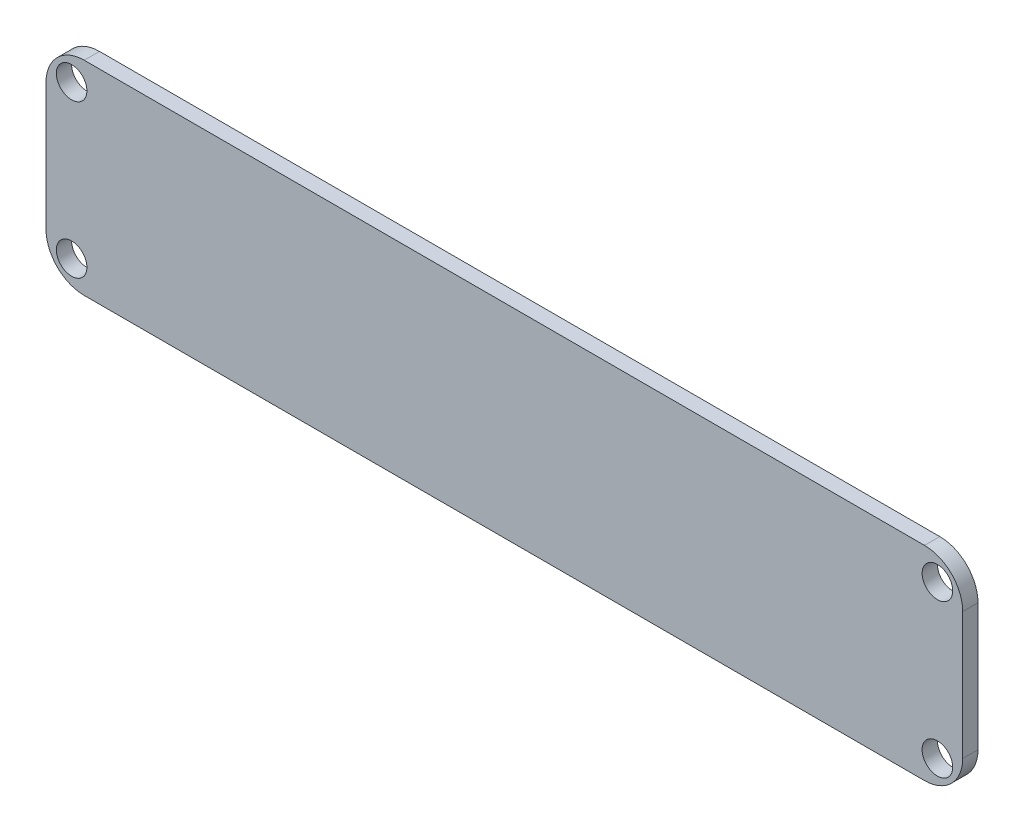
ISO-10303-21;
HEADER;
FILE_DESCRIPTION(('STEP AP214'),'2;1');
FILE_NAME('part.step','',(''),(''),'','','');
FILE_SCHEMA(('AUTOMOTIVE_DESIGN { 1 0 10303 214 1 1 1 1 }'));
ENDSEC;
DATA;
#1=APPLICATION_CONTEXT('core data for automotive mechanical design processes');
#2=APPLICATION_PROTOCOL_DEFINITION('international standard','automotive_design',2000,#1);
#3=PRODUCT_CONTEXT('',#1,'mechanical');
#4=PRODUCT('Part','Part','',(#3));
#5=PRODUCT_RELATED_PRODUCT_CATEGORY('part','',(#4));
#6=PRODUCT_DEFINITION_FORMATION('','',#4);
#7=PRODUCT_DEFINITION_CONTEXT('part definition',#1,'design');
#8=PRODUCT_DEFINITION('design','',#6,#7);
#9=PRODUCT_DEFINITION_SHAPE('','',#8);
#10=(LENGTH_UNIT() NAMED_UNIT(*) SI_UNIT(.MILLI.,.METRE.));
#11=(NAMED_UNIT(*) PLANE_ANGLE_UNIT() SI_UNIT($,.RADIAN.));
#12=(NAMED_UNIT(*) SI_UNIT($,.STERADIAN.) SOLID_ANGLE_UNIT());
#13=UNCERTAINTY_MEASURE_WITH_UNIT(LENGTH_MEASURE(1.E-05),#10,'distance_accuracy_value','');
#14=(GEOMETRIC_REPRESENTATION_CONTEXT(3) GLOBAL_UNCERTAINTY_ASSIGNED_CONTEXT((#13)) GLOBAL_UNIT_ASSIGNED_CONTEXT((#10,
#11,#12)) REPRESENTATION_CONTEXT('',''));
#15=CARTESIAN_POINT('',(0.,0.,0.));
#16=DIRECTION('',(0.,0.,1.));
#17=DIRECTION('',(1.,0.,0.));
#18=AXIS2_PLACEMENT_3D('',#15,#16,#17);
#19=CARTESIAN_POINT('',(0.,0.,1.2));
#20=DIRECTION('',(1.,0.,0.));
#21=DIRECTION('',(0.,0.,-1.));
#22=AXIS2_PLACEMENT_3D('',#19,#20,#21);
#23=PLANE('',#22);
#24=DIRECTION('',(0.,-1.,0.));
#25=VECTOR('',#24,1.);
#26=CARTESIAN_POINT('',(0.,0.,0.));
#27=LINE('',#26,#25);
#28=CARTESIAN_POINT('',(0.,13.,0.));
#29=VERTEX_POINT('',#28);
#30=CARTESIAN_POINT('',(0.,3.,0.));
#31=VERTEX_POINT('',#30);
#32=EDGE_CURVE('E136',#29,#31,#27,.T.);
#33=ORIENTED_EDGE('',*,*,#32,.T.);
#34=DIRECTION('',(0.,0.,-1.));
#35=VECTOR('',#34,1.);
#36=CARTESIAN_POINT('',(0.,3.,1.2));
#37=LINE('',#36,#35);
#38=CARTESIAN_POINT('',(0.,3.,1.2));
#39=VERTEX_POINT('',#38);
#40=EDGE_CURVE('E113',#31,#39,#37,.F.);
#41=ORIENTED_EDGE('',*,*,#40,.T.);
#42=DIRECTION('',(0.,-1.,0.));
#43=VECTOR('',#42,1.);
#44=CARTESIAN_POINT('',(0.,0.,1.2));
#45=LINE('',#44,#43);
#46=CARTESIAN_POINT('',(0.,13.,1.2));
#47=VERTEX_POINT('',#46);
#48=EDGE_CURVE('E146',#47,#39,#45,.T.);
#49=ORIENTED_EDGE('',*,*,#48,.F.);
#50=DIRECTION('',(0.,0.,-1.));
#51=VECTOR('',#50,1.);
#52=CARTESIAN_POINT('',(0.,13.,1.2));
#53=LINE('',#52,#51);
#54=EDGE_CURVE('E118',#47,#29,#53,.T.);
#55=ORIENTED_EDGE('',*,*,#54,.T.);
#56=EDGE_LOOP('',(#33,#41,#49,#55));
#57=FACE_BOUND('',#56,.T.);
#58=ADVANCED_FACE('F41',(#57),#23,.F.);
#59=CARTESIAN_POINT('',(0.,0.,1.2));
#60=DIRECTION('',(0.,1.,0.));
#61=DIRECTION('',(0.,0.,1.));
#62=AXIS2_PLACEMENT_3D('',#59,#60,#61);
#63=PLANE('',#62);
#64=DIRECTION('',(1.,0.,0.));
#65=VECTOR('',#64,1.);
#66=CARTESIAN_POINT('',(0.,0.,1.2));
#67=LINE('',#66,#65);
#68=CARTESIAN_POINT('',(3.,0.,1.2));
#69=VERTEX_POINT('',#68);
#70=CARTESIAN_POINT('',(69.,0.,1.2));
#71=VERTEX_POINT('',#70);
#72=EDGE_CURVE('E128',#69,#71,#67,.T.);
#73=ORIENTED_EDGE('',*,*,#72,.F.);
#74=DIRECTION('',(0.,0.,-1.));
#75=VECTOR('',#74,1.);
#76=CARTESIAN_POINT('',(3.,0.,1.2));
#77=LINE('',#76,#75);
#78=CARTESIAN_POINT('',(3.,0.,0.));
#79=VERTEX_POINT('',#78);
#80=EDGE_CURVE('E112',#69,#79,#77,.T.);
#81=ORIENTED_EDGE('',*,*,#80,.T.);
#82=DIRECTION('',(1.,0.,0.));
#83=VECTOR('',#82,1.);
#84=CARTESIAN_POINT('',(0.,0.,0.));
#85=LINE('',#84,#83);
#86=CARTESIAN_POINT('',(69.,0.,0.));
#87=VERTEX_POINT('',#86);
#88=EDGE_CURVE('E125',#79,#87,#85,.T.);
#89=ORIENTED_EDGE('',*,*,#88,.T.);
#90=DIRECTION('',(0.,0.,-1.));
#91=VECTOR('',#90,1.);
#92=CARTESIAN_POINT('',(69.,0.,1.2));
#93=LINE('',#92,#91);
#94=EDGE_CURVE('E130',#87,#71,#93,.F.);
#95=ORIENTED_EDGE('',*,*,#94,.T.);
#96=EDGE_LOOP('',(#73,#81,#89,#95));
#97=FACE_BOUND('',#96,.T.);
#98=ADVANCED_FACE('F124',(#97),#63,.F.);
#99=CARTESIAN_POINT('',(72.,0.,1.2));
#100=DIRECTION('',(-1.,0.,0.));
#101=DIRECTION('',(0.,0.,1.));
#102=AXIS2_PLACEMENT_3D('',#99,#100,#101);
#103=PLANE('',#102);
#104=DIRECTION('',(0.,1.,0.));
#105=VECTOR('',#104,1.);
#106=CARTESIAN_POINT('',(72.,0.,1.2));
#107=LINE('',#106,#105);
#108=CARTESIAN_POINT('',(72.,3.,1.2));
#109=VERTEX_POINT('',#108);
#110=CARTESIAN_POINT('',(72.,13.,1.2));
#111=VERTEX_POINT('',#110);
#112=EDGE_CURVE('E169',#109,#111,#107,.T.);
#113=ORIENTED_EDGE('',*,*,#112,.F.);
#114=DIRECTION('',(0.,0.,-1.));
#115=VECTOR('',#114,1.);
#116=CARTESIAN_POINT('',(72.,3.,1.2));
#117=LINE('',#116,#115);
#118=CARTESIAN_POINT('',(72.,3.,0.));
#119=VERTEX_POINT('',#118);
#120=EDGE_CURVE('E11',#109,#119,#117,.T.);
#121=ORIENTED_EDGE('',*,*,#120,.T.);
#122=DIRECTION('',(0.,1.,0.));
#123=VECTOR('',#122,1.);
#124=CARTESIAN_POINT('',(72.,0.,0.));
#125=LINE('',#124,#123);
#126=CARTESIAN_POINT('',(72.,13.,0.));
#127=VERTEX_POINT('',#126);
#128=EDGE_CURVE('E135',#119,#127,#125,.T.);
#129=ORIENTED_EDGE('',*,*,#128,.T.);
#130=DIRECTION('',(0.,0.,-1.));
#131=VECTOR('',#130,1.);
#132=CARTESIAN_POINT('',(72.,13.,1.2));
#133=LINE('',#132,#131);
#134=EDGE_CURVE('E49',#127,#111,#133,.F.);
#135=ORIENTED_EDGE('',*,*,#134,.T.);
#136=EDGE_LOOP('',(#113,#121,#129,#135));
#137=FACE_BOUND('',#136,.T.);
#138=ADVANCED_FACE('F168',(#137),#103,.F.);
#139=CARTESIAN_POINT('',(0.,16.,1.2));
#140=DIRECTION('',(0.,-1.,0.));
#141=DIRECTION('',(0.,0.,-1.));
#142=AXIS2_PLACEMENT_3D('',#139,#140,#141);
#143=PLANE('',#142);
#144=DIRECTION('',(-1.,0.,0.));
#145=VECTOR('',#144,1.);
#146=CARTESIAN_POINT('',(0.,16.,0.));
#147=LINE('',#146,#145);
#148=CARTESIAN_POINT('',(69.,16.,0.));
#149=VERTEX_POINT('',#148);
#150=CARTESIAN_POINT('',(3.,16.,0.));
#151=VERTEX_POINT('',#150);
#152=EDGE_CURVE('E139',#149,#151,#147,.T.);
#153=ORIENTED_EDGE('',*,*,#152,.T.);
#154=DIRECTION('',(0.,0.,-1.));
#155=VECTOR('',#154,1.);
#156=CARTESIAN_POINT('',(3.,16.,1.2));
#157=LINE('',#156,#155);
#158=CARTESIAN_POINT('',(3.,16.,1.2));
#159=VERTEX_POINT('',#158);
#160=EDGE_CURVE('E56',#151,#159,#157,.F.);
#161=ORIENTED_EDGE('',*,*,#160,.T.);
#162=DIRECTION('',(-1.,0.,0.));
#163=VECTOR('',#162,1.);
#164=CARTESIAN_POINT('',(0.,16.,1.2));
#165=LINE('',#164,#163);
#166=CARTESIAN_POINT('',(69.,16.,1.2));
#167=VERTEX_POINT('',#166);
#168=EDGE_CURVE('E147',#167,#159,#165,.T.);
#169=ORIENTED_EDGE('',*,*,#168,.F.);
#170=DIRECTION('',(0.,0.,-1.));
#171=VECTOR('',#170,1.);
#172=CARTESIAN_POINT('',(69.,16.,1.2));
#173=LINE('',#172,#171);
#174=EDGE_CURVE('E162',#167,#149,#173,.T.);
#175=ORIENTED_EDGE('',*,*,#174,.T.);
#176=EDGE_LOOP('',(#153,#161,#169,#175));
#177=FACE_BOUND('',#176,.T.);
#178=ADVANCED_FACE('F178',(#177),#143,.F.);
#179=CARTESIAN_POINT('',(0.,0.,1.2));
#180=DIRECTION('',(0.,0.,-1.));
#181=DIRECTION('',(-1.,0.,0.));
#182=AXIS2_PLACEMENT_3D('',#179,#180,#181);
#183=PLANE('',#182);
#184=CARTESIAN_POINT('',(70.01269494539,2.012672085344,1.2));
#185=DIRECTION('',(0.,0.,-1.));
#186=DIRECTION('',(-1.,0.,0.));
#187=AXIS2_PLACEMENT_3D('',#184,#185,#186);
#188=CIRCLE('',#187,1.2);
#189=CARTESIAN_POINT('',(68.81269494539,2.012672085344,1.2));
#190=VERTEX_POINT('',#189);
#191=EDGE_CURVE('E197',#190,#190,#188,.F.);
#192=ORIENTED_EDGE('',*,*,#191,.F.);
#193=EDGE_LOOP('',(#192));
#194=FACE_BOUND('',#193,.T.);
#195=CARTESIAN_POINT('',(2.01194998815146,14.012003328258,1.2));
#196=DIRECTION('',(0.,0.,-1.));
#197=DIRECTION('',(-1.,0.,0.));
#198=AXIS2_PLACEMENT_3D('',#195,#196,#197);
#199=CIRCLE('',#198,1.2);
#200=CARTESIAN_POINT('',(0.811949988151463,14.012003328258,1.2));
#201=VERTEX_POINT('',#200);
#202=EDGE_CURVE('E198',#201,#201,#199,.F.);
#203=ORIENTED_EDGE('',*,*,#202,.F.);
#204=EDGE_LOOP('',(#203));
#205=FACE_BOUND('',#204,.T.);
#206=CARTESIAN_POINT('',(2.01250190500404,2.01300990602,1.2));
#207=DIRECTION('',(0.,0.,-1.));
#208=DIRECTION('',(-1.,0.,0.));
#209=AXIS2_PLACEMENT_3D('',#206,#207,#208);
#210=CIRCLE('',#209,1.2);
#211=CARTESIAN_POINT('',(0.812501905004044,2.01300990602,1.2));
#212=VERTEX_POINT('',#211);
#213=EDGE_CURVE('E208',#212,#212,#210,.F.);
#214=ORIENTED_EDGE('',*,*,#213,.F.);
#215=EDGE_LOOP('',(#214));
#216=FACE_BOUND('',#215,.T.);
#217=CARTESIAN_POINT('',(70.012877825756,14.013032766066,1.2));
#218=DIRECTION('',(0.,0.,-1.));
#219=DIRECTION('',(-1.,0.,0.));
#220=AXIS2_PLACEMENT_3D('',#217,#218,#219);
#221=CIRCLE('',#220,1.2);
#222=CARTESIAN_POINT('',(68.812877825756,14.013032766066,1.2));
#223=VERTEX_POINT('',#222);
#224=EDGE_CURVE('E141',#223,#223,#221,.F.);
#225=ORIENTED_EDGE('',*,*,#224,.F.);
#226=EDGE_LOOP('',(#225));
#227=FACE_BOUND('',#226,.T.);
#228=ORIENTED_EDGE('',*,*,#48,.T.);
#229=CARTESIAN_POINT('',(3.,3.,1.2));
#230=DIRECTION('',(0.,0.,-1.));
#231=DIRECTION('',(-1.,0.,0.));
#232=AXIS2_PLACEMENT_3D('',#229,#230,#231);
#233=CIRCLE('',#232,3.);
#234=EDGE_CURVE('E160',#39,#69,#233,.F.);
#235=ORIENTED_EDGE('',*,*,#234,.T.);
#236=ORIENTED_EDGE('',*,*,#72,.T.);
#237=CARTESIAN_POINT('',(69.,3.,1.2));
#238=DIRECTION('',(0.,0.,-1.));
#239=DIRECTION('',(-1.,0.,0.));
#240=AXIS2_PLACEMENT_3D('',#237,#238,#239);
#241=CIRCLE('',#240,3.);
#242=EDGE_CURVE('E156',#71,#109,#241,.F.);
#243=ORIENTED_EDGE('',*,*,#242,.T.);
#244=ORIENTED_EDGE('',*,*,#112,.T.);
#245=CARTESIAN_POINT('',(69.,13.,1.2));
#246=DIRECTION('',(0.,0.,-1.));
#247=DIRECTION('',(-1.,0.,0.));
#248=AXIS2_PLACEMENT_3D('',#245,#246,#247);
#249=CIRCLE('',#248,3.);
#250=EDGE_CURVE('E63',#111,#167,#249,.F.);
#251=ORIENTED_EDGE('',*,*,#250,.T.);
#252=ORIENTED_EDGE('',*,*,#168,.T.);
#253=CARTESIAN_POINT('',(3.,13.,1.2));
#254=DIRECTION('',(0.,0.,-1.));
#255=DIRECTION('',(-1.,0.,0.));
#256=AXIS2_PLACEMENT_3D('',#253,#254,#255);
#257=CIRCLE('',#256,3.);
#258=EDGE_CURVE('E158',#159,#47,#257,.F.);
#259=ORIENTED_EDGE('',*,*,#258,.T.);
#260=EDGE_LOOP('',(#228,#235,#236,#243,#244,#251,#252,#259));
#261=FACE_BOUND('',#260,.T.);
#262=ADVANCED_FACE('F173',(#194,#205,#216,#227,#261),#183,.F.);
#263=CARTESIAN_POINT('',(0.,0.,0.));
#264=DIRECTION('',(0.,0.,-1.));
#265=DIRECTION('',(-1.,0.,0.));
#266=AXIS2_PLACEMENT_3D('',#263,#264,#265);
#267=PLANE('',#266);
#268=CARTESIAN_POINT('',(70.01269494539,2.012672085344,0.));
#269=DIRECTION('',(0.,0.,-1.));
#270=DIRECTION('',(-1.,0.,0.));
#271=AXIS2_PLACEMENT_3D('',#268,#269,#270);
#272=CIRCLE('',#271,1.2);
#273=CARTESIAN_POINT('',(68.81269494539,2.012672085344,0.));
#274=VERTEX_POINT('',#273);
#275=EDGE_CURVE('E193',#274,#274,#272,.T.);
#276=ORIENTED_EDGE('',*,*,#275,.F.);
#277=EDGE_LOOP('',(#276));
#278=FACE_BOUND('',#277,.T.);
#279=CARTESIAN_POINT('',(2.01194998815146,14.012003328258,0.));
#280=DIRECTION('',(0.,0.,-1.));
#281=DIRECTION('',(-1.,0.,0.));
#282=AXIS2_PLACEMENT_3D('',#279,#280,#281);
#283=CIRCLE('',#282,1.2);
#284=CARTESIAN_POINT('',(0.811949988151463,14.012003328258,0.));
#285=VERTEX_POINT('',#284);
#286=EDGE_CURVE('E194',#285,#285,#283,.T.);
#287=ORIENTED_EDGE('',*,*,#286,.F.);
#288=EDGE_LOOP('',(#287));
#289=FACE_BOUND('',#288,.T.);
#290=CARTESIAN_POINT('',(2.01250190500404,2.01300990602,0.));
#291=DIRECTION('',(0.,0.,-1.));
#292=DIRECTION('',(-1.,0.,0.));
#293=AXIS2_PLACEMENT_3D('',#290,#291,#292);
#294=CIRCLE('',#293,1.2);
#295=CARTESIAN_POINT('',(0.812501905004044,2.01300990602,0.));
#296=VERTEX_POINT('',#295);
#297=EDGE_CURVE('E201',#296,#296,#294,.T.);
#298=ORIENTED_EDGE('',*,*,#297,.F.);
#299=EDGE_LOOP('',(#298));
#300=FACE_BOUND('',#299,.T.);
#301=CARTESIAN_POINT('',(70.012877825756,14.013032766066,0.));
#302=DIRECTION('',(0.,0.,-1.));
#303=DIRECTION('',(-1.,0.,0.));
#304=AXIS2_PLACEMENT_3D('',#301,#302,#303);
#305=CIRCLE('',#304,1.2);
#306=CARTESIAN_POINT('',(68.812877825756,14.013032766066,0.));
#307=VERTEX_POINT('',#306);
#308=EDGE_CURVE('E190',#307,#307,#305,.T.);
#309=ORIENTED_EDGE('',*,*,#308,.F.);
#310=EDGE_LOOP('',(#309));
#311=FACE_BOUND('',#310,.T.);
#312=ORIENTED_EDGE('',*,*,#88,.F.);
#313=CARTESIAN_POINT('',(3.,3.,0.));
#314=DIRECTION('',(0.,0.,-1.));
#315=DIRECTION('',(-1.,0.,0.));
#316=AXIS2_PLACEMENT_3D('',#313,#314,#315);
#317=CIRCLE('',#316,3.);
#318=EDGE_CURVE('E108',#79,#31,#317,.T.);
#319=ORIENTED_EDGE('',*,*,#318,.T.);
#320=ORIENTED_EDGE('',*,*,#32,.F.);
#321=CARTESIAN_POINT('',(3.,13.,0.));
#322=DIRECTION('',(0.,0.,-1.));
#323=DIRECTION('',(-1.,0.,0.));
#324=AXIS2_PLACEMENT_3D('',#321,#322,#323);
#325=CIRCLE('',#324,3.);
#326=EDGE_CURVE('E119',#29,#151,#325,.T.);
#327=ORIENTED_EDGE('',*,*,#326,.T.);
#328=ORIENTED_EDGE('',*,*,#152,.F.);
#329=CARTESIAN_POINT('',(69.,13.,0.));
#330=DIRECTION('',(0.,0.,-1.));
#331=DIRECTION('',(-1.,0.,0.));
#332=AXIS2_PLACEMENT_3D('',#329,#330,#331);
#333=CIRCLE('',#332,3.);
#334=EDGE_CURVE('E129',#149,#127,#333,.T.);
#335=ORIENTED_EDGE('',*,*,#334,.T.);
#336=ORIENTED_EDGE('',*,*,#128,.F.);
#337=CARTESIAN_POINT('',(69.,3.,0.));
#338=DIRECTION('',(0.,0.,-1.));
#339=DIRECTION('',(-1.,0.,0.));
#340=AXIS2_PLACEMENT_3D('',#337,#338,#339);
#341=CIRCLE('',#340,3.);
#342=EDGE_CURVE('E134',#119,#87,#341,.T.);
#343=ORIENTED_EDGE('',*,*,#342,.T.);
#344=EDGE_LOOP('',(#312,#319,#320,#327,#328,#335,#336,#343));
#345=FACE_BOUND('',#344,.T.);
#346=ADVANCED_FACE('F132',(#278,#289,#300,#311,#345),#267,.T.);
#347=CARTESIAN_POINT('',(3.,3.,1.2));
#348=DIRECTION('',(0.,0.,-1.));
#349=DIRECTION('',(-1.,0.,0.));
#350=AXIS2_PLACEMENT_3D('',#347,#348,#349);
#351=CYLINDRICAL_SURFACE('',#350,3.);
#352=ORIENTED_EDGE('',*,*,#234,.F.);
#353=ORIENTED_EDGE('',*,*,#40,.F.);
#354=ORIENTED_EDGE('',*,*,#318,.F.);
#355=ORIENTED_EDGE('',*,*,#80,.F.);
#356=EDGE_LOOP('',(#352,#353,#354,#355));
#357=FACE_BOUND('',#356,.T.);
#358=ADVANCED_FACE('F111',(#357),#351,.T.);
#359=CARTESIAN_POINT('',(3.,13.,1.2));
#360=DIRECTION('',(0.,0.,-1.));
#361=DIRECTION('',(-1.,0.,0.));
#362=AXIS2_PLACEMENT_3D('',#359,#360,#361);
#363=CYLINDRICAL_SURFACE('',#362,3.);
#364=ORIENTED_EDGE('',*,*,#258,.F.);
#365=ORIENTED_EDGE('',*,*,#160,.F.);
#366=ORIENTED_EDGE('',*,*,#326,.F.);
#367=ORIENTED_EDGE('',*,*,#54,.F.);
#368=EDGE_LOOP('',(#364,#365,#366,#367));
#369=FACE_BOUND('',#368,.T.);
#370=ADVANCED_FACE('F182',(#369),#363,.T.);
#371=CARTESIAN_POINT('',(69.,3.,1.2));
#372=DIRECTION('',(0.,0.,-1.));
#373=DIRECTION('',(-1.,0.,0.));
#374=AXIS2_PLACEMENT_3D('',#371,#372,#373);
#375=CYLINDRICAL_SURFACE('',#374,3.);
#376=ORIENTED_EDGE('',*,*,#242,.F.);
#377=ORIENTED_EDGE('',*,*,#94,.F.);
#378=ORIENTED_EDGE('',*,*,#342,.F.);
#379=ORIENTED_EDGE('',*,*,#120,.F.);
#380=EDGE_LOOP('',(#376,#377,#378,#379));
#381=FACE_BOUND('',#380,.T.);
#382=ADVANCED_FACE('F232',(#381),#375,.T.);
#383=CARTESIAN_POINT('',(69.,13.,1.2));
#384=DIRECTION('',(0.,0.,-1.));
#385=DIRECTION('',(-1.,0.,0.));
#386=AXIS2_PLACEMENT_3D('',#383,#384,#385);
#387=CYLINDRICAL_SURFACE('',#386,3.);
#388=ORIENTED_EDGE('',*,*,#250,.F.);
#389=ORIENTED_EDGE('',*,*,#134,.F.);
#390=ORIENTED_EDGE('',*,*,#334,.F.);
#391=ORIENTED_EDGE('',*,*,#174,.F.);
#392=EDGE_LOOP('',(#388,#389,#390,#391));
#393=FACE_BOUND('',#392,.T.);
#394=ADVANCED_FACE('F43',(#393),#387,.T.);
#395=CARTESIAN_POINT('',(70.012877825756,14.013032766066,1.201));
#396=DIRECTION('',(0.,0.,-1.));
#397=DIRECTION('',(-1.,0.,0.));
#398=AXIS2_PLACEMENT_3D('',#395,#396,#397);
#399=CYLINDRICAL_SURFACE('',#398,1.2);
#400=ORIENTED_EDGE('',*,*,#308,.T.);
#401=EDGE_LOOP('',(#400));
#402=FACE_BOUND('',#401,.T.);
#403=ORIENTED_EDGE('',*,*,#224,.T.);
#404=EDGE_LOOP('',(#403));
#405=FACE_BOUND('',#404,.T.);
#406=ADVANCED_FACE('F220',(#402,#405),#399,.F.);
#407=CARTESIAN_POINT('',(2.01250190500404,2.01300990602,1.201));
#408=DIRECTION('',(0.,0.,-1.));
#409=DIRECTION('',(-1.,0.,0.));
#410=AXIS2_PLACEMENT_3D('',#407,#408,#409);
#411=CYLINDRICAL_SURFACE('',#410,1.2);
#412=ORIENTED_EDGE('',*,*,#297,.T.);
#413=EDGE_LOOP('',(#412));
#414=FACE_BOUND('',#413,.T.);
#415=ORIENTED_EDGE('',*,*,#213,.T.);
#416=EDGE_LOOP('',(#415));
#417=FACE_BOUND('',#416,.T.);
#418=ADVANCED_FACE('F212',(#414,#417),#411,.F.);
#419=CARTESIAN_POINT('',(2.01194998815146,14.012003328258,1.201));
#420=DIRECTION('',(0.,0.,-1.));
#421=DIRECTION('',(-1.,0.,0.));
#422=AXIS2_PLACEMENT_3D('',#419,#420,#421);
#423=CYLINDRICAL_SURFACE('',#422,1.2);
#424=ORIENTED_EDGE('',*,*,#286,.T.);
#425=EDGE_LOOP('',(#424));
#426=FACE_BOUND('',#425,.T.);
#427=ORIENTED_EDGE('',*,*,#202,.T.);
#428=EDGE_LOOP('',(#427));
#429=FACE_BOUND('',#428,.T.);
#430=ADVANCED_FACE('F228',(#426,#429),#423,.F.);
#431=CARTESIAN_POINT('',(70.01269494539,2.012672085344,1.201));
#432=DIRECTION('',(0.,0.,-1.));
#433=DIRECTION('',(-1.,0.,0.));
#434=AXIS2_PLACEMENT_3D('',#431,#432,#433);
#435=CYLINDRICAL_SURFACE('',#434,1.2);
#436=ORIENTED_EDGE('',*,*,#275,.T.);
#437=EDGE_LOOP('',(#436));
#438=FACE_BOUND('',#437,.T.);
#439=ORIENTED_EDGE('',*,*,#191,.T.);
#440=EDGE_LOOP('',(#439));
#441=FACE_BOUND('',#440,.T.);
#442=ADVANCED_FACE('F300',(#438,#441),#435,.F.);
#443=CLOSED_SHELL('',(#58,#98,#138,#178,#262,#346,#358,#370,#382,#394,#406,#418,#430,#442));
#444=MANIFOLD_SOLID_BREP('B2',#443);
#445=ADVANCED_BREP_SHAPE_REPRESENTATION('',(#18,#444),#14);
#446=SHAPE_DEFINITION_REPRESENTATION(#9,#445);
ENDSEC;
END-ISO-10303-21;
